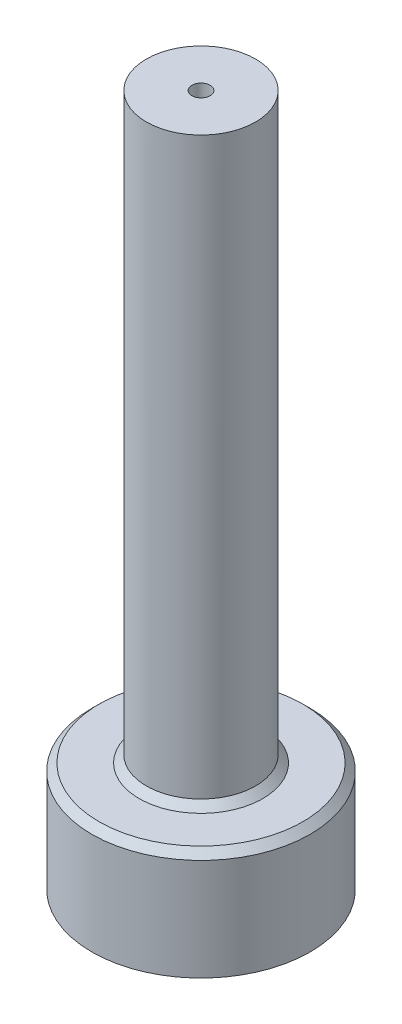
ISO-10303-21;
HEADER;
FILE_DESCRIPTION(('STEP AP214'),'2;1');
FILE_NAME('part.step','',(''),(''),'','','');
FILE_SCHEMA(('AUTOMOTIVE_DESIGN { 1 0 10303 214 1 1 1 1 }'));
ENDSEC;
DATA;
#1=APPLICATION_CONTEXT('core data for automotive mechanical design processes');
#2=APPLICATION_PROTOCOL_DEFINITION('international standard','automotive_design',2000,#1);
#3=PRODUCT_CONTEXT('',#1,'mechanical');
#4=PRODUCT('Part','Part','',(#3));
#5=PRODUCT_RELATED_PRODUCT_CATEGORY('part','',(#4));
#6=PRODUCT_DEFINITION_FORMATION('','',#4);
#7=PRODUCT_DEFINITION_CONTEXT('part definition',#1,'design');
#8=PRODUCT_DEFINITION('design','',#6,#7);
#9=PRODUCT_DEFINITION_SHAPE('','',#8);
#10=(LENGTH_UNIT() NAMED_UNIT(*) SI_UNIT(.MILLI.,.METRE.));
#11=(NAMED_UNIT(*) PLANE_ANGLE_UNIT() SI_UNIT($,.RADIAN.));
#12=(NAMED_UNIT(*) SI_UNIT($,.STERADIAN.) SOLID_ANGLE_UNIT());
#13=UNCERTAINTY_MEASURE_WITH_UNIT(LENGTH_MEASURE(1.E-05),#10,'distance_accuracy_value','');
#14=(GEOMETRIC_REPRESENTATION_CONTEXT(3) GLOBAL_UNCERTAINTY_ASSIGNED_CONTEXT((#13)) GLOBAL_UNIT_ASSIGNED_CONTEXT((#10,
#11,#12)) REPRESENTATION_CONTEXT('',''));
#15=CARTESIAN_POINT('',(0.,0.,0.));
#16=DIRECTION('',(0.,0.,1.));
#17=DIRECTION('',(1.,0.,0.));
#18=AXIS2_PLACEMENT_3D('',#15,#16,#17);
#19=CARTESIAN_POINT('',(0.,190.,0.));
#20=DIRECTION('',(0.,-1.,0.));
#21=DIRECTION('',(0.,0.,-1.));
#22=AXIS2_PLACEMENT_3D('',#19,#20,#21);
#23=CYLINDRICAL_SURFACE('',#22,15.);
#24=CARTESIAN_POINT('',(0.,32.,0.));
#25=DIRECTION('',(0.,-1.,0.));
#26=DIRECTION('',(0.,0.,-1.));
#27=AXIS2_PLACEMENT_3D('',#24,#25,#26);
#28=CIRCLE('',#27,15.);
#29=CARTESIAN_POINT('',(0.,32.,-15.));
#30=VERTEX_POINT('',#29);
#31=EDGE_CURVE('E49',#30,#30,#28,.F.);
#32=ORIENTED_EDGE('',*,*,#31,.T.);
#33=EDGE_LOOP('',(#32));
#34=FACE_BOUND('',#33,.T.);
#35=CARTESIAN_POINT('',(0.,190.,0.));
#36=DIRECTION('',(0.,1.,0.));
#37=DIRECTION('',(0.,0.,1.));
#38=AXIS2_PLACEMENT_3D('',#35,#36,#37);
#39=CIRCLE('',#38,15.);
#40=CARTESIAN_POINT('',(0.,190.,15.));
#41=VERTEX_POINT('',#40);
#42=EDGE_CURVE('E93',#41,#41,#39,.T.);
#43=ORIENTED_EDGE('',*,*,#42,.F.);
#44=EDGE_LOOP('',(#43));
#45=FACE_BOUND('',#44,.T.);
#46=ADVANCED_FACE('F35',(#34,#45),#23,.T.);
#47=CARTESIAN_POINT('',(0.,190.,0.));
#48=DIRECTION('',(0.,1.,0.));
#49=DIRECTION('',(0.,0.,1.));
#50=AXIS2_PLACEMENT_3D('',#47,#48,#49);
#51=PLANE('',#50);
#52=CARTESIAN_POINT('',(0.,190.,0.));
#53=DIRECTION('',(0.,1.,0.));
#54=DIRECTION('',(0.,0.,1.));
#55=AXIS2_PLACEMENT_3D('',#52,#53,#54);
#56=CIRCLE('',#55,2.5);
#57=CARTESIAN_POINT('',(-0.0910860226375952,190.,2.4983401162532));
#58=VERTEX_POINT('',#57);
#59=EDGE_CURVE('E101',#58,#58,#56,.T.);
#60=ORIENTED_EDGE('',*,*,#59,.F.);
#61=EDGE_LOOP('',(#60));
#62=FACE_BOUND('',#61,.T.);
#63=ORIENTED_EDGE('',*,*,#42,.T.);
#64=EDGE_LOOP('',(#63));
#65=FACE_BOUND('',#64,.T.);
#66=ADVANCED_FACE('F75',(#62,#65),#51,.T.);
#67=CARTESIAN_POINT('',(0.,30.,0.));
#68=DIRECTION('',(0.,-1.,0.));
#69=DIRECTION('',(0.,0.,-1.));
#70=AXIS2_PLACEMENT_3D('',#67,#68,#69);
#71=CYLINDRICAL_SURFACE('',#70,30.);
#72=CARTESIAN_POINT('',(0.,28.,0.));
#73=DIRECTION('',(0.,-1.,0.));
#74=DIRECTION('',(0.,0.,-1.));
#75=AXIS2_PLACEMENT_3D('',#72,#73,#74);
#76=CIRCLE('',#75,30.);
#77=CARTESIAN_POINT('',(0.,28.,-30.));
#78=VERTEX_POINT('',#77);
#79=EDGE_CURVE('E44',#78,#78,#76,.T.);
#80=ORIENTED_EDGE('',*,*,#79,.T.);
#81=EDGE_LOOP('',(#80));
#82=FACE_BOUND('',#81,.T.);
#83=CARTESIAN_POINT('',(0.,0.,0.));
#84=DIRECTION('',(0.,-1.,0.));
#85=DIRECTION('',(0.,0.,-1.));
#86=AXIS2_PLACEMENT_3D('',#83,#84,#85);
#87=CIRCLE('',#86,30.);
#88=CARTESIAN_POINT('',(0.,0.,-30.));
#89=VERTEX_POINT('',#88);
#90=EDGE_CURVE('E96',#89,#89,#87,.T.);
#91=ORIENTED_EDGE('',*,*,#90,.F.);
#92=EDGE_LOOP('',(#91));
#93=FACE_BOUND('',#92,.T.);
#94=ADVANCED_FACE('F147',(#82,#93),#71,.T.);
#95=CARTESIAN_POINT('',(0.,30.,0.));
#96=DIRECTION('',(0.,-1.,0.));
#97=DIRECTION('',(0.,0.,-1.));
#98=AXIS2_PLACEMENT_3D('',#95,#96,#97);
#99=PLANE('',#98);
#100=CARTESIAN_POINT('',(0.,30.,0.));
#101=DIRECTION('',(0.,-1.,0.));
#102=DIRECTION('',(0.,0.,-1.));
#103=AXIS2_PLACEMENT_3D('',#100,#101,#102);
#104=CIRCLE('',#103,28.);
#105=CARTESIAN_POINT('',(0.,30.,-28.));
#106=VERTEX_POINT('',#105);
#107=EDGE_CURVE('E11',#106,#106,#104,.F.);
#108=ORIENTED_EDGE('',*,*,#107,.T.);
#109=EDGE_LOOP('',(#108));
#110=FACE_BOUND('',#109,.T.);
#111=CARTESIAN_POINT('',(0.,30.,0.));
#112=DIRECTION('',(0.,-1.,0.));
#113=DIRECTION('',(0.,0.,-1.));
#114=AXIS2_PLACEMENT_3D('',#111,#112,#113);
#115=CIRCLE('',#114,17.);
#116=CARTESIAN_POINT('',(0.,30.,-17.));
#117=VERTEX_POINT('',#116);
#118=EDGE_CURVE('E91',#117,#117,#115,.T.);
#119=ORIENTED_EDGE('',*,*,#118,.T.);
#120=EDGE_LOOP('',(#119));
#121=FACE_BOUND('',#120,.T.);
#122=ADVANCED_FACE('F74',(#110,#121),#99,.F.);
#123=CARTESIAN_POINT('',(0.,0.,0.));
#124=DIRECTION('',(0.,1.,0.));
#125=DIRECTION('',(0.,0.,1.));
#126=AXIS2_PLACEMENT_3D('',#123,#124,#125);
#127=PLANE('',#126);
#128=CARTESIAN_POINT('',(0.,0.,0.));
#129=DIRECTION('',(0.,-1.,0.));
#130=DIRECTION('',(0.,0.,-1.));
#131=AXIS2_PLACEMENT_3D('',#128,#129,#130);
#132=CIRCLE('',#131,22.5);
#133=CARTESIAN_POINT('',(0.,0.,-22.5));
#134=VERTEX_POINT('',#133);
#135=EDGE_CURVE('E57',#134,#134,#132,.T.);
#136=ORIENTED_EDGE('',*,*,#135,.F.);
#137=EDGE_LOOP('',(#136));
#138=FACE_BOUND('',#137,.T.);
#139=ORIENTED_EDGE('',*,*,#90,.T.);
#140=EDGE_LOOP('',(#139));
#141=FACE_BOUND('',#140,.T.);
#142=ADVANCED_FACE('F63',(#138,#141),#127,.F.);
#143=CARTESIAN_POINT('',(0.,30.,0.));
#144=DIRECTION('',(0.,-1.,0.));
#145=DIRECTION('',(0.,0.,-1.));
#146=AXIS2_PLACEMENT_3D('',#143,#144,#145);
#147=CONICAL_SURFACE('',#146,17.,0.785398163397452);
#148=ORIENTED_EDGE('',*,*,#31,.F.);
#149=EDGE_LOOP('',(#148));
#150=FACE_BOUND('',#149,.T.);
#151=ORIENTED_EDGE('',*,*,#118,.F.);
#152=EDGE_LOOP('',(#151));
#153=FACE_BOUND('',#152,.T.);
#154=ADVANCED_FACE('F73',(#150,#153),#147,.T.);
#155=CARTESIAN_POINT('',(0.,28.,0.));
#156=DIRECTION('',(0.,-1.,0.));
#157=DIRECTION('',(0.,0.,-1.));
#158=AXIS2_PLACEMENT_3D('',#155,#156,#157);
#159=CONICAL_SURFACE('',#158,30.,0.785398163397454);
#160=ORIENTED_EDGE('',*,*,#107,.F.);
#161=EDGE_LOOP('',(#160));
#162=FACE_BOUND('',#161,.T.);
#163=ORIENTED_EDGE('',*,*,#79,.F.);
#164=EDGE_LOOP('',(#163));
#165=FACE_BOUND('',#164,.T.);
#166=ADVANCED_FACE('F37',(#162,#165),#159,.T.);
#167=CARTESIAN_POINT('',(-0.0910860226375952,190.,2.4983401162532));
#168=CARTESIAN_POINT('',(-0.44364160409685,30.,1.95017489654502));
#169=CARTESIAN_POINT('',(-5.087766255144,190.,2.31616807097801));
#170=CARTESIAN_POINT('',(-4.34399139718689,30.,1.06289168835132));
#171=CARTESIAN_POINT('',(-4.90559420986881,190.,-2.68051216152839));
#172=CARTESIAN_POINT('',(-3.45670818899319,30.,-2.83745810473872));
#173=CARTESIAN_POINT('',(0.0910860226375949,190.,-2.4983401162532));
#174=CARTESIAN_POINT('',(0.44364160409685,30.,-1.95017489654502));
#175=CARTESIAN_POINT('',(5.087766255144,190.,-2.31616807097801));
#176=CARTESIAN_POINT('',(4.34399139718689,30.,-1.06289168835132));
#177=CARTESIAN_POINT('',(4.90559420986881,190.,2.68051216152839));
#178=CARTESIAN_POINT('',(3.45670818899319,30.,2.83745810473872));
#179=CARTESIAN_POINT('',(-0.0910860226375952,190.,2.4983401162532));
#180=CARTESIAN_POINT('',(-0.44364160409685,30.,1.95017489654502));
#181=(BOUNDED_SURFACE() B_SPLINE_SURFACE(3,1,((#167,#168),(#169,#170),(#171,#172),(#173,#174),
(#175,#176),(#177,#178),(#179,#180)),.UNSPECIFIED.,.T.,.F.,.F.) B_SPLINE_SURFACE_WITH_KNOTS((4,
3,4),(2,2),(0.,0.5,1.),(0.,1.),
.UNSPECIFIED.) GEOMETRIC_REPRESENTATION_ITEM() RATIONAL_B_SPLINE_SURFACE(((1.,1.),
(0.333333333333333,0.333333333333333),(0.333333333333333,0.333333333333333),(1.,1.),
(0.333333333333333,0.333333333333333),(0.333333333333333,0.333333333333333),(1.,1.))) REPRESENTATION_ITEM('') SURFACE());
#182=CARTESIAN_POINT('',(0.,30.,0.));
#183=DIRECTION('',(0.,1.,0.));
#184=DIRECTION('',(0.,0.,1.));
#185=AXIS2_PLACEMENT_3D('',#182,#183,#184);
#186=CIRCLE('',#185,2.);
#187=CARTESIAN_POINT('',(-0.44364160409685,30.,1.95017489654502));
#188=VERTEX_POINT('',#187);
#189=EDGE_CURVE('E39',#188,#188,#186,.T.);
#190=CARTESIAN_POINT('',(-0.0910860226375952,190.,2.4983401162532));
#191=CARTESIAN_POINT('',(-0.0947584766111291,188.333333333333,2.49263006188124));
#192=CARTESIAN_POINT('',(-0.098430930584663,186.666666666667,2.48692000750928));
#193=CARTESIAN_POINT('',(-0.105775838531731,183.333333333333,2.47549989876536));
#194=CARTESIAN_POINT('',(-0.109448292505265,181.666666666667,2.4697898443934));
#195=CARTESIAN_POINT('',(-0.116793200452333,178.333333333333,2.45836973564948));
#196=CARTESIAN_POINT('',(-0.120465654425866,176.666666666667,2.45265968127752));
#197=CARTESIAN_POINT('',(-0.127810562372934,173.333333333333,2.4412395725336));
#198=CARTESIAN_POINT('',(-0.131483016346468,171.666666666667,2.43552951816164));
#199=CARTESIAN_POINT('',(-0.138827924293536,168.333333333333,2.42410940941772));
#200=CARTESIAN_POINT('',(-0.14250037826707,166.666666666667,2.41839935504576));
#201=CARTESIAN_POINT('',(-0.149845286214138,163.333333333333,2.40697924630184));
#202=CARTESIAN_POINT('',(-0.153517740187672,161.666666666667,2.40126919192988));
#203=CARTESIAN_POINT('',(-0.160862648134739,158.333333333333,2.38984908318596));
#204=CARTESIAN_POINT('',(-0.164535102108273,156.666666666667,2.384139028814));
#205=CARTESIAN_POINT('',(-0.171880010055341,153.333333333333,2.37271892007008));
#206=CARTESIAN_POINT('',(-0.175552464028875,151.666666666667,2.36700886569812));
#207=CARTESIAN_POINT('',(-0.182897371975943,148.333333333333,2.35558875695419));
#208=CARTESIAN_POINT('',(-0.186569825949477,146.666666666667,2.34987870258223));
#209=CARTESIAN_POINT('',(-0.193914733896545,143.333333333333,2.33845859383831));
#210=CARTESIAN_POINT('',(-0.197587187870079,141.666666666667,2.33274853946635));
#211=CARTESIAN_POINT('',(-0.204932095817146,138.333333333333,2.32132843072243));
#212=CARTESIAN_POINT('',(-0.20860454979068,136.666666666667,2.31561837635047));
#213=CARTESIAN_POINT('',(-0.215949457737748,133.333333333333,2.30419826760655));
#214=CARTESIAN_POINT('',(-0.219621911711282,131.666666666667,2.29848821323459));
#215=CARTESIAN_POINT('',(-0.22696681965835,128.333333333333,2.28706810449067));
#216=CARTESIAN_POINT('',(-0.230639273631884,126.666666666667,2.28135805011871));
#217=CARTESIAN_POINT('',(-0.237984181578952,123.333333333333,2.26993794137479));
#218=CARTESIAN_POINT('',(-0.241656635552485,121.666666666667,2.26422788700283));
#219=CARTESIAN_POINT('',(-0.249001543499553,118.333333333333,2.25280777825891));
#220=CARTESIAN_POINT('',(-0.252673997473087,116.666666666667,2.24709772388695));
#221=CARTESIAN_POINT('',(-0.260018905420155,113.333333333333,2.23567761514303));
#222=CARTESIAN_POINT('',(-0.263691359393689,111.666666666667,2.22996756077107));
#223=CARTESIAN_POINT('',(-0.271036267340757,108.333333333333,2.21854745202715));
#224=CARTESIAN_POINT('',(-0.274708721314291,106.666666666667,2.21283739765519));
#225=CARTESIAN_POINT('',(-0.282053629261358,103.333333333333,2.20141728891127));
#226=CARTESIAN_POINT('',(-0.285726083234892,101.666666666667,2.19570723453931));
#227=CARTESIAN_POINT('',(-0.29307099118196,98.3333333333333,2.18428712579539));
#228=CARTESIAN_POINT('',(-0.296743445155494,96.6666666666667,2.17857707142343));
#229=CARTESIAN_POINT('',(-0.304088353102562,93.3333333333333,2.16715696267951));
#230=CARTESIAN_POINT('',(-0.307760807076096,91.6666666666667,2.16144690830755));
#231=CARTESIAN_POINT('',(-0.315105715023164,88.3333333333333,2.15002679956363));
#232=CARTESIAN_POINT('',(-0.318778168996697,86.6666666666667,2.14431674519167));
#233=CARTESIAN_POINT('',(-0.326123076943765,83.3333333333333,2.13289663644775));
#234=CARTESIAN_POINT('',(-0.329795530917299,81.6666666666667,2.12718658207579));
#235=CARTESIAN_POINT('',(-0.337140438864367,78.3333333333333,2.11576647333187));
#236=CARTESIAN_POINT('',(-0.340812892837901,76.6666666666667,2.11005641895991));
#237=CARTESIAN_POINT('',(-0.348157800784969,73.3333333333333,2.09863631021598));
#238=CARTESIAN_POINT('',(-0.351830254758503,71.6666666666667,2.09292625584402));
#239=CARTESIAN_POINT('',(-0.35917516270557,68.3333333333333,2.0815061471001));
#240=CARTESIAN_POINT('',(-0.362847616679104,66.6666666666667,2.07579609272814));
#241=CARTESIAN_POINT('',(-0.370192524626172,63.3333333333333,2.06437598398422));
#242=CARTESIAN_POINT('',(-0.373864978599706,61.6666666666667,2.05866592961226));
#243=CARTESIAN_POINT('',(-0.381209886546774,58.3333333333333,2.04724582086834));
#244=CARTESIAN_POINT('',(-0.384882340520308,56.6666666666667,2.04153576649638));
#245=CARTESIAN_POINT('',(-0.392227248467376,53.3333333333333,2.03011565775246));
#246=CARTESIAN_POINT('',(-0.395899702440909,51.6666666666667,2.0244056033805));
#247=CARTESIAN_POINT('',(-0.403244610387977,48.3333333333333,2.01298549463658));
#248=CARTESIAN_POINT('',(-0.406917064361511,46.6666666666667,2.00727544026462));
#249=CARTESIAN_POINT('',(-0.414261972308579,43.3333333333333,1.9958553315207));
#250=CARTESIAN_POINT('',(-0.417934426282113,41.6666666666667,1.99014527714874));
#251=CARTESIAN_POINT('',(-0.425279334229181,38.3333333333333,1.97872516840482));
#252=CARTESIAN_POINT('',(-0.428951788202715,36.6666666666667,1.97301511403286));
#253=CARTESIAN_POINT('',(-0.436296696149783,33.3333333333333,1.96159500528894));
#254=CARTESIAN_POINT('',(-0.439969150123316,31.6666666666667,1.95588495091698));
#255=CARTESIAN_POINT('',(-0.44364160409685,30.,1.95017489654502));
#256=B_SPLINE_CURVE_WITH_KNOTS('',3,(#190,#191,#192,#193,#194,#195,#196,#197,#198,#199,#200,
#201,#202,#203,#204,#205,#206,#207,#208,#209,#210,#211,#212,#213,#214,#215,#216,#217,#218,#219,
#220,#221,#222,#223,#224,#225,#226,#227,#228,#229,#230,#231,#232,#233,#234,#235,#236,#237,#238,
#239,#240,#241,#242,#243,#244,#245,#246,#247,#248,#249,#250,#251,#252,#253,#254,#255),
.UNSPECIFIED.,.F.,.F.,(4,2,2,2,2,2,2,2,2,2,2,2,2,2,2,2,2,2,2,2,2,2,2,2,2,2,2,2,2,2,2,2,4),(0.,
5.00004148230313,10.0000829646063,15.0001244469094,20.0001659292125,25.0002074115156,
30.0002488938188,35.0002903761219,40.000331858425,45.0003733407281,50.0004148230313,
55.0004563053344,60.0004977876375,65.0005392699407,70.0005807522438,75.0006222345469,
80.0006637168501,85.0007051991532,90.0007466814563,95.0007881637595,100.000829646063,
105.000871128366,110.000912610669,115.000954092972,120.000995575275,125.001037057578,
130.001078539881,135.001120022185,140.001161504488,145.001202986791,150.001244469094,
155.001285951397,160.0013274337),.UNSPECIFIED.);
#257=EDGE_CURVE('BSEAM84',#58,#188,#256,.T.);
#258=ORIENTED_EDGE('',*,*,#59,.T.);
#259=ORIENTED_EDGE('',*,*,#189,.F.);
#260=ORIENTED_EDGE('',*,*,#257,.T.);
#261=ORIENTED_EDGE('',*,*,#257,.F.);
#262=EDGE_LOOP('',(#258,#260,#259,#261));
#263=FACE_BOUND('',#262,.T.);
#264=ADVANCED_FACE('F84',(#263),#181,.F.);
#265=CARTESIAN_POINT('',(0.,30.,0.));
#266=DIRECTION('',(0.,-1.,0.));
#267=DIRECTION('',(0.,0.,-1.));
#268=AXIS2_PLACEMENT_3D('',#265,#266,#267);
#269=CONICAL_SURFACE('',#268,2.,0.599452484841738);
#270=ORIENTED_EDGE('',*,*,#189,.T.);
#271=EDGE_LOOP('',(#270));
#272=FACE_BOUND('',#271,.T.);
#273=ORIENTED_EDGE('',*,*,#135,.T.);
#274=EDGE_LOOP('',(#273));
#275=FACE_BOUND('',#274,.T.);
#276=ADVANCED_FACE('F113',(#272,#275),#269,.F.);
#277=CLOSED_SHELL('',(#46,#66,#94,#122,#142,#154,#166,#264,#276));
#278=MANIFOLD_SOLID_BREP('B2',#277);
#279=ADVANCED_BREP_SHAPE_REPRESENTATION('',(#18,#278),#14);
#280=SHAPE_DEFINITION_REPRESENTATION(#9,#279);
ENDSEC;
END-ISO-10303-21;
